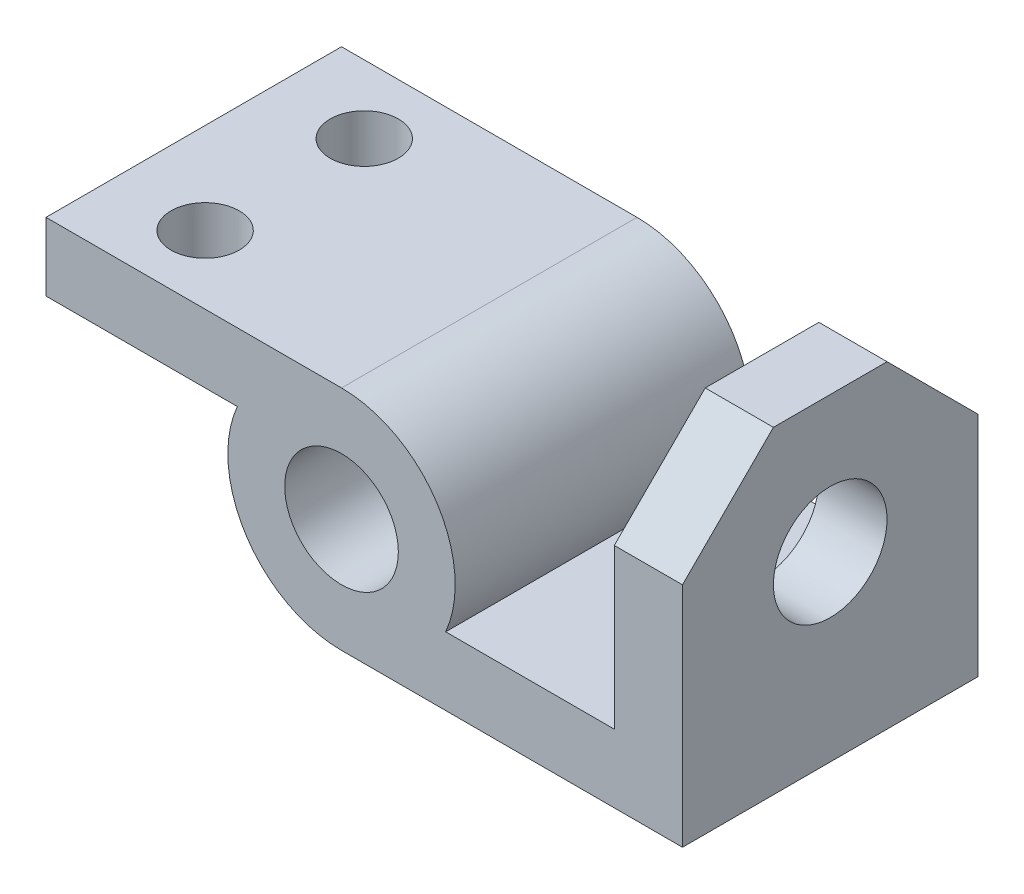
ISO-10303-21;
HEADER;
FILE_DESCRIPTION(('STEP AP214'),'2;1');
FILE_NAME('part.step','',(''),(''),'','','');
FILE_SCHEMA(('AUTOMOTIVE_DESIGN { 1 0 10303 214 1 1 1 1 }'));
ENDSEC;
DATA;
#1=APPLICATION_CONTEXT('core data for automotive mechanical design processes');
#2=APPLICATION_PROTOCOL_DEFINITION('international standard','automotive_design',2000,#1);
#3=PRODUCT_CONTEXT('',#1,'mechanical');
#4=PRODUCT('Part','Part','',(#3));
#5=PRODUCT_RELATED_PRODUCT_CATEGORY('part','',(#4));
#6=PRODUCT_DEFINITION_FORMATION('','',#4);
#7=PRODUCT_DEFINITION_CONTEXT('part definition',#1,'design');
#8=PRODUCT_DEFINITION('design','',#6,#7);
#9=PRODUCT_DEFINITION_SHAPE('','',#8);
#10=(LENGTH_UNIT() NAMED_UNIT(*) SI_UNIT(.MILLI.,.METRE.));
#11=(NAMED_UNIT(*) PLANE_ANGLE_UNIT() SI_UNIT($,.RADIAN.));
#12=(NAMED_UNIT(*) SI_UNIT($,.STERADIAN.) SOLID_ANGLE_UNIT());
#13=UNCERTAINTY_MEASURE_WITH_UNIT(LENGTH_MEASURE(1.E-05),#10,'distance_accuracy_value','');
#14=(GEOMETRIC_REPRESENTATION_CONTEXT(3) GLOBAL_UNCERTAINTY_ASSIGNED_CONTEXT((#13)) GLOBAL_UNIT_ASSIGNED_CONTEXT((#10,
#11,#12)) REPRESENTATION_CONTEXT('',''));
#15=CARTESIAN_POINT('',(0.,0.,0.));
#16=DIRECTION('',(0.,0.,1.));
#17=DIRECTION('',(1.,0.,0.));
#18=AXIS2_PLACEMENT_3D('',#15,#16,#17);
#19=CARTESIAN_POINT('',(76.2,-12.7,41.275));
#20=DIRECTION('',(1.,0.,0.));
#21=DIRECTION('',(0.,0.,-1.));
#22=AXIS2_PLACEMENT_3D('',#19,#20,#21);
#23=PLANE('',#22);
#24=CARTESIAN_POINT('',(76.2,19.05,0.));
#25=DIRECTION('',(1.,0.,0.));
#26=DIRECTION('',(0.,0.,-1.));
#27=AXIS2_PLACEMENT_3D('',#24,#25,#26);
#28=CIRCLE('',#27,15.875);
#29=CARTESIAN_POINT('',(76.2,19.05,-15.875));
#30=VERTEX_POINT('',#29);
#31=EDGE_CURVE('E324',#30,#30,#28,.F.);
#32=ORIENTED_EDGE('',*,*,#31,.F.);
#33=EDGE_LOOP('',(#32));
#34=FACE_BOUND('',#33,.T.);
#35=DIRECTION('',(0.,0.,-1.));
#36=VECTOR('',#35,1.);
#37=CARTESIAN_POINT('',(76.2,57.15,41.275));
#38=LINE('',#37,#36);
#39=CARTESIAN_POINT('',(76.2,57.15,15.8749999999999));
#40=VERTEX_POINT('',#39);
#41=CARTESIAN_POINT('',(76.2,57.15,-15.8749999999999));
#42=VERTEX_POINT('',#41);
#43=EDGE_CURVE('E184',#40,#42,#38,.T.);
#44=ORIENTED_EDGE('',*,*,#43,.T.);
#45=DIRECTION('',(0.,0.707106781186548,0.707106781186548));
#46=VECTOR('',#45,1.);
#47=CARTESIAN_POINT('',(76.2,57.15,-15.8749999999999));
#48=LINE('',#47,#46);
#49=CARTESIAN_POINT('',(76.2,31.7499999999999,-41.275));
#50=VERTEX_POINT('',#49);
#51=EDGE_CURVE('E169',#42,#50,#48,.F.);
#52=ORIENTED_EDGE('',*,*,#51,.T.);
#53=DIRECTION('',(0.,-1.,0.));
#54=VECTOR('',#53,1.);
#55=CARTESIAN_POINT('',(76.2,-12.7,-41.275));
#56=LINE('',#55,#54);
#57=CARTESIAN_POINT('',(76.2,-12.7,-41.275));
#58=VERTEX_POINT('',#57);
#59=EDGE_CURVE('E148',#50,#58,#56,.T.);
#60=ORIENTED_EDGE('',*,*,#59,.T.);
#61=DIRECTION('',(0.,0.,-1.));
#62=VECTOR('',#61,1.);
#63=CARTESIAN_POINT('',(76.2,-12.7,41.275));
#64=LINE('',#63,#62);
#65=CARTESIAN_POINT('',(76.2,-12.7,41.275));
#66=VERTEX_POINT('',#65);
#67=EDGE_CURVE('E141',#66,#58,#64,.T.);
#68=ORIENTED_EDGE('',*,*,#67,.F.);
#69=DIRECTION('',(0.,-1.,0.));
#70=VECTOR('',#69,1.);
#71=CARTESIAN_POINT('',(76.2,-12.7,41.275));
#72=LINE('',#71,#70);
#73=CARTESIAN_POINT('',(76.2,31.7499999999999,41.275));
#74=VERTEX_POINT('',#73);
#75=EDGE_CURVE('E128',#74,#66,#72,.T.);
#76=ORIENTED_EDGE('',*,*,#75,.F.);
#77=DIRECTION('',(0.,0.707106781186548,-0.707106781186548));
#78=VECTOR('',#77,1.);
#79=CARTESIAN_POINT('',(76.2,31.7499999999999,41.275));
#80=LINE('',#79,#78);
#81=EDGE_CURVE('E167',#74,#40,#80,.T.);
#82=ORIENTED_EDGE('',*,*,#81,.T.);
#83=EDGE_LOOP('',(#44,#52,#60,#68,#76,#82));
#84=FACE_BOUND('',#83,.T.);
#85=ADVANCED_FACE('F35',(#34,#84),#23,.F.);
#86=CARTESIAN_POINT('',(76.2,-12.7,41.275));
#87=DIRECTION('',(0.,-1.,0.));
#88=DIRECTION('',(1.,0.,0.));
#89=AXIS2_PLACEMENT_3D('',#86,#87,#88);
#90=PLANE('',#89);
#91=DIRECTION('',(-1.,0.,0.));
#92=VECTOR('',#91,1.);
#93=CARTESIAN_POINT('',(76.2,-12.7,-41.275));
#94=LINE('',#93,#92);
#95=CARTESIAN_POINT('',(29.0993556629696,-12.7,-41.275));
#96=VERTEX_POINT('',#95);
#97=EDGE_CURVE('E189',#58,#96,#94,.T.);
#98=ORIENTED_EDGE('',*,*,#97,.T.);
#99=DIRECTION('',(0.,0.,-1.));
#100=VECTOR('',#99,1.);
#101=CARTESIAN_POINT('',(29.0993556629696,-12.7,41.275));
#102=LINE('',#101,#100);
#103=CARTESIAN_POINT('',(29.0993556629696,-12.7,41.275));
#104=VERTEX_POINT('',#103);
#105=EDGE_CURVE('E143',#104,#96,#102,.T.);
#106=ORIENTED_EDGE('',*,*,#105,.F.);
#107=DIRECTION('',(-1.,0.,0.));
#108=VECTOR('',#107,1.);
#109=CARTESIAN_POINT('',(76.2,-12.7,41.275));
#110=LINE('',#109,#108);
#111=EDGE_CURVE('E131',#66,#104,#110,.T.);
#112=ORIENTED_EDGE('',*,*,#111,.F.);
#113=ORIENTED_EDGE('',*,*,#67,.T.);
#114=EDGE_LOOP('',(#98,#106,#112,#113));
#115=FACE_BOUND('',#114,.T.);
#116=ADVANCED_FACE('F140',(#115),#90,.F.);
#117=CARTESIAN_POINT('',(0.,0.,41.275));
#118=DIRECTION('',(0.,0.,-1.));
#119=DIRECTION('',(-1.,0.,0.));
#120=AXIS2_PLACEMENT_3D('',#117,#118,#119);
#121=CYLINDRICAL_SURFACE('',#120,31.75);
#122=CARTESIAN_POINT('',(0.,0.,-41.275));
#123=DIRECTION('',(0.,0.,1.));
#124=DIRECTION('',(1.,0.,0.));
#125=AXIS2_PLACEMENT_3D('',#122,#123,#124);
#126=CIRCLE('',#125,31.75);
#127=CARTESIAN_POINT('',(0.,31.75,-41.275));
#128=VERTEX_POINT('',#127);
#129=EDGE_CURVE('E191',#96,#128,#126,.T.);
#130=ORIENTED_EDGE('',*,*,#129,.T.);
#131=DIRECTION('',(0.,0.,-1.));
#132=VECTOR('',#131,1.);
#133=CARTESIAN_POINT('',(0.,31.75,41.275));
#134=LINE('',#133,#132);
#135=CARTESIAN_POINT('',(0.,31.75,41.275));
#136=VERTEX_POINT('',#135);
#137=EDGE_CURVE('E154',#136,#128,#134,.T.);
#138=ORIENTED_EDGE('',*,*,#137,.F.);
#139=CARTESIAN_POINT('',(0.,0.,41.275));
#140=DIRECTION('',(0.,0.,1.));
#141=DIRECTION('',(1.,0.,0.));
#142=AXIS2_PLACEMENT_3D('',#139,#140,#141);
#143=CIRCLE('',#142,31.75);
#144=EDGE_CURVE('E145',#104,#136,#143,.T.);
#145=ORIENTED_EDGE('',*,*,#144,.F.);
#146=ORIENTED_EDGE('',*,*,#105,.T.);
#147=EDGE_LOOP('',(#130,#138,#145,#146));
#148=FACE_BOUND('',#147,.T.);
#149=ADVANCED_FACE('F269',(#148),#121,.T.);
#150=CARTESIAN_POINT('',(0.,31.75,41.275));
#151=DIRECTION('',(0.,-1.,0.));
#152=DIRECTION('',(1.,0.,0.));
#153=AXIS2_PLACEMENT_3D('',#150,#151,#152);
#154=PLANE('',#153);
#155=CARTESIAN_POINT('',(-57.15,31.75,-22.225));
#156=DIRECTION('',(0.,1.,0.));
#157=DIRECTION('',(-1.,0.,0.));
#158=AXIS2_PLACEMENT_3D('',#155,#156,#157);
#159=CIRCLE('',#158,9.525);
#160=CARTESIAN_POINT('',(-66.675,31.75,-22.225));
#161=VERTEX_POINT('',#160);
#162=EDGE_CURVE('E162',#161,#161,#159,.T.);
#163=ORIENTED_EDGE('',*,*,#162,.F.);
#164=EDGE_LOOP('',(#163));
#165=FACE_BOUND('',#164,.T.);
#166=CARTESIAN_POINT('',(-57.15,31.75,22.225));
#167=DIRECTION('',(0.,1.,0.));
#168=DIRECTION('',(1.,0.,0.));
#169=AXIS2_PLACEMENT_3D('',#166,#167,#168);
#170=CIRCLE('',#169,9.525);
#171=CARTESIAN_POINT('',(-47.625,31.75,22.225));
#172=VERTEX_POINT('',#171);
#173=EDGE_CURVE('E325',#172,#172,#170,.T.);
#174=ORIENTED_EDGE('',*,*,#173,.F.);
#175=EDGE_LOOP('',(#174));
#176=FACE_BOUND('',#175,.T.);
#177=DIRECTION('',(-1.,0.,0.));
#178=VECTOR('',#177,1.);
#179=CARTESIAN_POINT('',(0.,31.75,-41.275));
#180=LINE('',#179,#178);
#181=CARTESIAN_POINT('',(-82.55,31.75,-41.275));
#182=VERTEX_POINT('',#181);
#183=EDGE_CURVE('E198',#128,#182,#180,.T.);
#184=ORIENTED_EDGE('',*,*,#183,.T.);
#185=DIRECTION('',(0.,0.,-1.));
#186=VECTOR('',#185,1.);
#187=CARTESIAN_POINT('',(-82.55,31.75,41.275));
#188=LINE('',#187,#186);
#189=CARTESIAN_POINT('',(-82.55,31.75,41.275));
#190=VERTEX_POINT('',#189);
#191=EDGE_CURVE('E220',#190,#182,#188,.T.);
#192=ORIENTED_EDGE('',*,*,#191,.F.);
#193=DIRECTION('',(-1.,0.,0.));
#194=VECTOR('',#193,1.);
#195=CARTESIAN_POINT('',(0.,31.75,41.275));
#196=LINE('',#195,#194);
#197=EDGE_CURVE('E229',#136,#190,#196,.T.);
#198=ORIENTED_EDGE('',*,*,#197,.F.);
#199=ORIENTED_EDGE('',*,*,#137,.T.);
#200=EDGE_LOOP('',(#184,#192,#198,#199));
#201=FACE_BOUND('',#200,.T.);
#202=ADVANCED_FACE('F227',(#165,#176,#201),#154,.F.);
#203=CARTESIAN_POINT('',(-82.55,31.75,41.275));
#204=DIRECTION('',(1.,0.,0.));
#205=DIRECTION('',(0.,1.,0.));
#206=AXIS2_PLACEMENT_3D('',#203,#204,#205);
#207=PLANE('',#206);
#208=DIRECTION('',(0.,-1.,0.));
#209=VECTOR('',#208,1.);
#210=CARTESIAN_POINT('',(-82.55,31.75,-41.275));
#211=LINE('',#210,#209);
#212=CARTESIAN_POINT('',(-82.55,12.7,-41.275));
#213=VERTEX_POINT('',#212);
#214=EDGE_CURVE('E200',#182,#213,#211,.T.);
#215=ORIENTED_EDGE('',*,*,#214,.T.);
#216=DIRECTION('',(0.,0.,-1.));
#217=VECTOR('',#216,1.);
#218=CARTESIAN_POINT('',(-82.55,12.7,41.275));
#219=LINE('',#218,#217);
#220=CARTESIAN_POINT('',(-82.55,12.7,41.275));
#221=VERTEX_POINT('',#220);
#222=EDGE_CURVE('E217',#221,#213,#219,.T.);
#223=ORIENTED_EDGE('',*,*,#222,.F.);
#224=DIRECTION('',(0.,-1.,0.));
#225=VECTOR('',#224,1.);
#226=CARTESIAN_POINT('',(-82.55,31.75,41.275));
#227=LINE('',#226,#225);
#228=EDGE_CURVE('E245',#190,#221,#227,.T.);
#229=ORIENTED_EDGE('',*,*,#228,.F.);
#230=ORIENTED_EDGE('',*,*,#191,.T.);
#231=EDGE_LOOP('',(#215,#223,#229,#230));
#232=FACE_BOUND('',#231,.T.);
#233=ADVANCED_FACE('F236',(#232),#207,.F.);
#234=CARTESIAN_POINT('',(-82.55,12.7,41.275));
#235=DIRECTION('',(0.,1.,0.));
#236=DIRECTION('',(0.,0.,1.));
#237=AXIS2_PLACEMENT_3D('',#234,#235,#236);
#238=PLANE('',#237);
#239=CARTESIAN_POINT('',(-57.15,12.7,-22.225));
#240=DIRECTION('',(0.,1.,0.));
#241=DIRECTION('',(0.,0.,1.));
#242=AXIS2_PLACEMENT_3D('',#239,#240,#241);
#243=CIRCLE('',#242,9.525);
#244=CARTESIAN_POINT('',(-57.15,12.7,-12.7));
#245=VERTEX_POINT('',#244);
#246=EDGE_CURVE('E161',#245,#245,#243,.T.);
#247=ORIENTED_EDGE('',*,*,#246,.T.);
#248=EDGE_LOOP('',(#247));
#249=FACE_BOUND('',#248,.T.);
#250=CARTESIAN_POINT('',(-57.15,12.7,22.225));
#251=DIRECTION('',(0.,1.,0.));
#252=DIRECTION('',(0.,0.,1.));
#253=AXIS2_PLACEMENT_3D('',#250,#251,#252);
#254=CIRCLE('',#253,9.525);
#255=CARTESIAN_POINT('',(-57.15,12.7,31.75));
#256=VERTEX_POINT('',#255);
#257=EDGE_CURVE('E158',#256,#256,#254,.T.);
#258=ORIENTED_EDGE('',*,*,#257,.T.);
#259=EDGE_LOOP('',(#258));
#260=FACE_BOUND('',#259,.T.);
#261=DIRECTION('',(1.,0.,0.));
#262=VECTOR('',#261,1.);
#263=CARTESIAN_POINT('',(-82.55,12.7,-41.275));
#264=LINE('',#263,#262);
#265=CARTESIAN_POINT('',(-29.0993556629696,12.7,-41.275));
#266=VERTEX_POINT('',#265);
#267=EDGE_CURVE('E202',#213,#266,#264,.T.);
#268=ORIENTED_EDGE('',*,*,#267,.T.);
#269=DIRECTION('',(0.,0.,-1.));
#270=VECTOR('',#269,1.);
#271=CARTESIAN_POINT('',(-29.0993556629696,12.7,41.275));
#272=LINE('',#271,#270);
#273=CARTESIAN_POINT('',(-29.0993556629696,12.7,41.275));
#274=VERTEX_POINT('',#273);
#275=EDGE_CURVE('E214',#274,#266,#272,.T.);
#276=ORIENTED_EDGE('',*,*,#275,.F.);
#277=DIRECTION('',(1.,0.,0.));
#278=VECTOR('',#277,1.);
#279=CARTESIAN_POINT('',(-82.55,12.7,41.275));
#280=LINE('',#279,#278);
#281=EDGE_CURVE('E242',#221,#274,#280,.T.);
#282=ORIENTED_EDGE('',*,*,#281,.F.);
#283=ORIENTED_EDGE('',*,*,#222,.T.);
#284=EDGE_LOOP('',(#268,#276,#282,#283));
#285=FACE_BOUND('',#284,.T.);
#286=ADVANCED_FACE('F240',(#249,#260,#285),#238,.F.);
#287=CARTESIAN_POINT('',(0.,0.,41.275));
#288=DIRECTION('',(0.,0.,-1.));
#289=DIRECTION('',(-1.,0.,0.));
#290=AXIS2_PLACEMENT_3D('',#287,#288,#289);
#291=CYLINDRICAL_SURFACE('',#290,31.75);
#292=CARTESIAN_POINT('',(0.,0.,-41.275));
#293=DIRECTION('',(0.,0.,1.));
#294=DIRECTION('',(1.,0.,0.));
#295=AXIS2_PLACEMENT_3D('',#292,#293,#294);
#296=CIRCLE('',#295,31.75);
#297=CARTESIAN_POINT('',(0.,-31.75,-41.275));
#298=VERTEX_POINT('',#297);
#299=EDGE_CURVE('E204',#266,#298,#296,.T.);
#300=ORIENTED_EDGE('',*,*,#299,.T.);
#301=DIRECTION('',(0.,0.,-1.));
#302=VECTOR('',#301,1.);
#303=CARTESIAN_POINT('',(0.,-31.75,41.275));
#304=LINE('',#303,#302);
#305=CARTESIAN_POINT('',(0.,-31.75,41.275));
#306=VERTEX_POINT('',#305);
#307=EDGE_CURVE('E211',#306,#298,#304,.T.);
#308=ORIENTED_EDGE('',*,*,#307,.F.);
#309=CARTESIAN_POINT('',(0.,0.,41.275));
#310=DIRECTION('',(0.,0.,1.));
#311=DIRECTION('',(1.,0.,0.));
#312=AXIS2_PLACEMENT_3D('',#309,#310,#311);
#313=CIRCLE('',#312,31.75);
#314=EDGE_CURVE('E244',#274,#306,#313,.T.);
#315=ORIENTED_EDGE('',*,*,#314,.F.);
#316=ORIENTED_EDGE('',*,*,#275,.T.);
#317=EDGE_LOOP('',(#300,#308,#315,#316));
#318=FACE_BOUND('',#317,.T.);
#319=ADVANCED_FACE('F287',(#318),#291,.T.);
#320=CARTESIAN_POINT('',(0.,-31.75,41.275));
#321=DIRECTION('',(0.,1.,0.));
#322=DIRECTION('',(0.,0.,1.));
#323=AXIS2_PLACEMENT_3D('',#320,#321,#322);
#324=PLANE('',#323);
#325=DIRECTION('',(1.,0.,0.));
#326=VECTOR('',#325,1.);
#327=CARTESIAN_POINT('',(0.,-31.75,-41.275));
#328=LINE('',#327,#326);
#329=CARTESIAN_POINT('',(95.25,-31.75,-41.275));
#330=VERTEX_POINT('',#329);
#331=EDGE_CURVE('E206',#298,#330,#328,.T.);
#332=ORIENTED_EDGE('',*,*,#331,.T.);
#333=DIRECTION('',(0.,0.,-1.));
#334=VECTOR('',#333,1.);
#335=CARTESIAN_POINT('',(95.25,-31.75,41.275));
#336=LINE('',#335,#334);
#337=CARTESIAN_POINT('',(95.25,-31.75,41.275));
#338=VERTEX_POINT('',#337);
#339=EDGE_CURVE('E183',#338,#330,#336,.T.);
#340=ORIENTED_EDGE('',*,*,#339,.F.);
#341=DIRECTION('',(1.,0.,0.));
#342=VECTOR('',#341,1.);
#343=CARTESIAN_POINT('',(0.,-31.75,41.275));
#344=LINE('',#343,#342);
#345=EDGE_CURVE('E247',#306,#338,#344,.T.);
#346=ORIENTED_EDGE('',*,*,#345,.F.);
#347=ORIENTED_EDGE('',*,*,#307,.T.);
#348=EDGE_LOOP('',(#332,#340,#346,#347));
#349=FACE_BOUND('',#348,.T.);
#350=ADVANCED_FACE('F291',(#349),#324,.F.);
#351=CARTESIAN_POINT('',(95.25,57.15,41.275));
#352=DIRECTION('',(-1.,0.,0.));
#353=DIRECTION('',(0.,0.,1.));
#354=AXIS2_PLACEMENT_3D('',#351,#352,#353);
#355=PLANE('',#354);
#356=CARTESIAN_POINT('',(95.25,19.05,0.));
#357=DIRECTION('',(1.,0.,0.));
#358=DIRECTION('',(0.,0.,-1.));
#359=AXIS2_PLACEMENT_3D('',#356,#357,#358);
#360=CIRCLE('',#359,15.875);
#361=CARTESIAN_POINT('',(95.25,19.05,-15.875));
#362=VERTEX_POINT('',#361);
#363=EDGE_CURVE('E322',#362,#362,#360,.T.);
#364=ORIENTED_EDGE('',*,*,#363,.F.);
#365=EDGE_LOOP('',(#364));
#366=FACE_BOUND('',#365,.T.);
#367=DIRECTION('',(0.,1.,0.));
#368=VECTOR('',#367,1.);
#369=CARTESIAN_POINT('',(95.25,57.15,-41.275));
#370=LINE('',#369,#368);
#371=CARTESIAN_POINT('',(95.25,31.7499999999999,-41.275));
#372=VERTEX_POINT('',#371);
#373=EDGE_CURVE('E136',#330,#372,#370,.T.);
#374=ORIENTED_EDGE('',*,*,#373,.T.);
#375=DIRECTION('',(0.,-0.707106781186548,-0.707106781186548));
#376=VECTOR('',#375,1.);
#377=CARTESIAN_POINT('',(95.25,57.15,-15.8749999999999));
#378=LINE('',#377,#376);
#379=CARTESIAN_POINT('',(95.25,57.15,-15.8749999999999));
#380=VERTEX_POINT('',#379);
#381=EDGE_CURVE('E44',#372,#380,#378,.F.);
#382=ORIENTED_EDGE('',*,*,#381,.T.);
#383=DIRECTION('',(0.,0.,-1.));
#384=VECTOR('',#383,1.);
#385=CARTESIAN_POINT('',(95.25,57.15,41.275));
#386=LINE('',#385,#384);
#387=CARTESIAN_POINT('',(95.25,57.15,15.8749999999999));
#388=VERTEX_POINT('',#387);
#389=EDGE_CURVE('E175',#388,#380,#386,.T.);
#390=ORIENTED_EDGE('',*,*,#389,.F.);
#391=DIRECTION('',(0.,-0.707106781186548,0.707106781186548));
#392=VECTOR('',#391,1.);
#393=CARTESIAN_POINT('',(95.25,31.7499999999999,41.275));
#394=LINE('',#393,#392);
#395=CARTESIAN_POINT('',(95.25,31.7499999999999,41.275));
#396=VERTEX_POINT('',#395);
#397=EDGE_CURVE('E51',#388,#396,#394,.T.);
#398=ORIENTED_EDGE('',*,*,#397,.T.);
#399=DIRECTION('',(0.,1.,0.));
#400=VECTOR('',#399,1.);
#401=CARTESIAN_POINT('',(95.25,57.15,41.275));
#402=LINE('',#401,#400);
#403=EDGE_CURVE('E194',#338,#396,#402,.T.);
#404=ORIENTED_EDGE('',*,*,#403,.F.);
#405=ORIENTED_EDGE('',*,*,#339,.T.);
#406=EDGE_LOOP('',(#374,#382,#390,#398,#404,#405));
#407=FACE_BOUND('',#406,.T.);
#408=ADVANCED_FACE('F174',(#366,#407),#355,.F.);
#409=CARTESIAN_POINT('',(76.2,57.15,41.275));
#410=DIRECTION('',(0.,-1.,0.));
#411=DIRECTION('',(0.,0.,-1.));
#412=AXIS2_PLACEMENT_3D('',#409,#410,#411);
#413=PLANE('',#412);
#414=ORIENTED_EDGE('',*,*,#389,.T.);
#415=DIRECTION('',(-1.,0.,0.));
#416=VECTOR('',#415,1.);
#417=CARTESIAN_POINT('',(76.2,57.15,-15.8749999999999));
#418=LINE('',#417,#416);
#419=EDGE_CURVE('E152',#380,#42,#418,.T.);
#420=ORIENTED_EDGE('',*,*,#419,.T.);
#421=ORIENTED_EDGE('',*,*,#43,.F.);
#422=DIRECTION('',(1.,0.,0.));
#423=VECTOR('',#422,1.);
#424=CARTESIAN_POINT('',(95.25,57.15,15.8749999999999));
#425=LINE('',#424,#423);
#426=EDGE_CURVE('E150',#40,#388,#425,.T.);
#427=ORIENTED_EDGE('',*,*,#426,.T.);
#428=EDGE_LOOP('',(#414,#420,#421,#427));
#429=FACE_BOUND('',#428,.T.);
#430=ADVANCED_FACE('F180',(#429),#413,.F.);
#431=CARTESIAN_POINT('',(0.,0.,41.275));
#432=DIRECTION('',(0.,0.,1.));
#433=DIRECTION('',(1.,0.,0.));
#434=AXIS2_PLACEMENT_3D('',#431,#432,#433);
#435=PLANE('',#434);
#436=CARTESIAN_POINT('',(0.,0.,41.275));
#437=DIRECTION('',(0.,0.,1.));
#438=DIRECTION('',(1.,0.,0.));
#439=AXIS2_PLACEMENT_3D('',#436,#437,#438);
#440=CIRCLE('',#439,15.875);
#441=CARTESIAN_POINT('',(15.875,0.,41.275));
#442=VERTEX_POINT('',#441);
#443=EDGE_CURVE('E332',#442,#442,#440,.T.);
#444=ORIENTED_EDGE('',*,*,#443,.F.);
#445=EDGE_LOOP('',(#444));
#446=FACE_BOUND('',#445,.T.);
#447=ORIENTED_EDGE('',*,*,#403,.T.);
#448=DIRECTION('',(-1.,0.,0.));
#449=VECTOR('',#448,1.);
#450=CARTESIAN_POINT('',(76.2,31.7499999999999,41.275));
#451=LINE('',#450,#449);
#452=EDGE_CURVE('E11',#396,#74,#451,.T.);
#453=ORIENTED_EDGE('',*,*,#452,.T.);
#454=ORIENTED_EDGE('',*,*,#75,.T.);
#455=ORIENTED_EDGE('',*,*,#111,.T.);
#456=ORIENTED_EDGE('',*,*,#144,.T.);
#457=ORIENTED_EDGE('',*,*,#197,.T.);
#458=ORIENTED_EDGE('',*,*,#228,.T.);
#459=ORIENTED_EDGE('',*,*,#281,.T.);
#460=ORIENTED_EDGE('',*,*,#314,.T.);
#461=ORIENTED_EDGE('',*,*,#345,.T.);
#462=EDGE_LOOP('',(#447,#453,#454,#455,#456,#457,#458,#459,#460,#461));
#463=FACE_BOUND('',#462,.T.);
#464=ADVANCED_FACE('F130',(#446,#463),#435,.T.);
#465=CARTESIAN_POINT('',(0.,0.,-41.275));
#466=DIRECTION('',(0.,0.,1.));
#467=DIRECTION('',(1.,0.,0.));
#468=AXIS2_PLACEMENT_3D('',#465,#466,#467);
#469=PLANE('',#468);
#470=CARTESIAN_POINT('',(0.,0.,-41.275));
#471=DIRECTION('',(0.,0.,1.));
#472=DIRECTION('',(1.,0.,0.));
#473=AXIS2_PLACEMENT_3D('',#470,#471,#472);
#474=CIRCLE('',#473,15.875);
#475=CARTESIAN_POINT('',(15.875,0.,-41.275));
#476=VERTEX_POINT('',#475);
#477=EDGE_CURVE('E329',#476,#476,#474,.T.);
#478=ORIENTED_EDGE('',*,*,#477,.T.);
#479=EDGE_LOOP('',(#478));
#480=FACE_BOUND('',#479,.T.);
#481=ORIENTED_EDGE('',*,*,#59,.F.);
#482=DIRECTION('',(1.,0.,0.));
#483=VECTOR('',#482,1.);
#484=CARTESIAN_POINT('',(0.,31.7499999999999,-41.275));
#485=LINE('',#484,#483);
#486=EDGE_CURVE('E59',#50,#372,#485,.T.);
#487=ORIENTED_EDGE('',*,*,#486,.T.);
#488=ORIENTED_EDGE('',*,*,#373,.F.);
#489=ORIENTED_EDGE('',*,*,#331,.F.);
#490=ORIENTED_EDGE('',*,*,#299,.F.);
#491=ORIENTED_EDGE('',*,*,#267,.F.);
#492=ORIENTED_EDGE('',*,*,#214,.F.);
#493=ORIENTED_EDGE('',*,*,#183,.F.);
#494=ORIENTED_EDGE('',*,*,#129,.F.);
#495=ORIENTED_EDGE('',*,*,#97,.F.);
#496=EDGE_LOOP('',(#481,#487,#488,#489,#490,#491,#492,#493,#494,#495));
#497=FACE_BOUND('',#496,.T.);
#498=ADVANCED_FACE('F187',(#480,#497),#469,.F.);
#499=CARTESIAN_POINT('',(-57.15,-31.75,22.225));
#500=DIRECTION('',(0.,1.,0.));
#501=DIRECTION('',(-1.,0.,0.));
#502=AXIS2_PLACEMENT_3D('',#499,#500,#501);
#503=CYLINDRICAL_SURFACE('',#502,9.525);
#504=ORIENTED_EDGE('',*,*,#173,.T.);
#505=EDGE_LOOP('',(#504));
#506=FACE_BOUND('',#505,.T.);
#507=ORIENTED_EDGE('',*,*,#257,.F.);
#508=EDGE_LOOP('',(#507));
#509=FACE_BOUND('',#508,.T.);
#510=ADVANCED_FACE('F303',(#506,#509),#503,.F.);
#511=CARTESIAN_POINT('',(-57.15,-31.75,-22.225));
#512=DIRECTION('',(0.,1.,0.));
#513=DIRECTION('',(-1.,0.,0.));
#514=AXIS2_PLACEMENT_3D('',#511,#512,#513);
#515=CYLINDRICAL_SURFACE('',#514,9.525);
#516=ORIENTED_EDGE('',*,*,#162,.T.);
#517=EDGE_LOOP('',(#516));
#518=FACE_BOUND('',#517,.T.);
#519=ORIENTED_EDGE('',*,*,#246,.F.);
#520=EDGE_LOOP('',(#519));
#521=FACE_BOUND('',#520,.T.);
#522=ADVANCED_FACE('F310',(#518,#521),#515,.F.);
#523=CARTESIAN_POINT('',(-82.551,19.05,0.));
#524=DIRECTION('',(1.,0.,0.));
#525=DIRECTION('',(0.,0.,-1.));
#526=AXIS2_PLACEMENT_3D('',#523,#524,#525);
#527=CYLINDRICAL_SURFACE('',#526,15.875);
#528=ORIENTED_EDGE('',*,*,#363,.T.);
#529=EDGE_LOOP('',(#528));
#530=FACE_BOUND('',#529,.T.);
#531=ORIENTED_EDGE('',*,*,#31,.T.);
#532=EDGE_LOOP('',(#531));
#533=FACE_BOUND('',#532,.T.);
#534=ADVANCED_FACE('F262',(#530,#533),#527,.F.);
#535=CARTESIAN_POINT('',(76.2,57.15,-15.8749999999999));
#536=DIRECTION('',(0.,-0.707106781186548,0.707106781186548));
#537=DIRECTION('',(-1.,0.,0.));
#538=AXIS2_PLACEMENT_3D('',#535,#536,#537);
#539=PLANE('',#538);
#540=ORIENTED_EDGE('',*,*,#381,.F.);
#541=ORIENTED_EDGE('',*,*,#486,.F.);
#542=ORIENTED_EDGE('',*,*,#51,.F.);
#543=ORIENTED_EDGE('',*,*,#419,.F.);
#544=EDGE_LOOP('',(#540,#541,#542,#543));
#545=FACE_BOUND('',#544,.T.);
#546=ADVANCED_FACE('F186',(#545),#539,.F.);
#547=CARTESIAN_POINT('',(0.,31.7499999999999,41.275));
#548=DIRECTION('',(0.,0.707106781186548,0.707106781186548));
#549=DIRECTION('',(1.,0.,0.));
#550=AXIS2_PLACEMENT_3D('',#547,#548,#549);
#551=PLANE('',#550);
#552=ORIENTED_EDGE('',*,*,#397,.F.);
#553=ORIENTED_EDGE('',*,*,#426,.F.);
#554=ORIENTED_EDGE('',*,*,#81,.F.);
#555=ORIENTED_EDGE('',*,*,#452,.F.);
#556=EDGE_LOOP('',(#552,#553,#554,#555));
#557=FACE_BOUND('',#556,.T.);
#558=ADVANCED_FACE('F38',(#557),#551,.T.);
#559=CARTESIAN_POINT('',(0.,0.,-41.275));
#560=DIRECTION('',(0.,0.,1.));
#561=DIRECTION('',(1.,0.,0.));
#562=AXIS2_PLACEMENT_3D('',#559,#560,#561);
#563=CYLINDRICAL_SURFACE('',#562,15.875);
#564=ORIENTED_EDGE('',*,*,#477,.F.);
#565=EDGE_LOOP('',(#564));
#566=FACE_BOUND('',#565,.T.);
#567=ORIENTED_EDGE('',*,*,#443,.T.);
#568=EDGE_LOOP('',(#567));
#569=FACE_BOUND('',#568,.T.);
#570=ADVANCED_FACE('F255',(#566,#569),#563,.F.);
#571=CLOSED_SHELL('',(#85,#116,#149,#202,#233,#286,#319,#350,#408,#430,#464,#498,#510,#522,#534,
#546,#558,#570));
#572=MANIFOLD_SOLID_BREP('B2',#571);
#573=ADVANCED_BREP_SHAPE_REPRESENTATION('',(#18,#572),#14);
#574=SHAPE_DEFINITION_REPRESENTATION(#9,#573);
ENDSEC;
END-ISO-10303-21;
